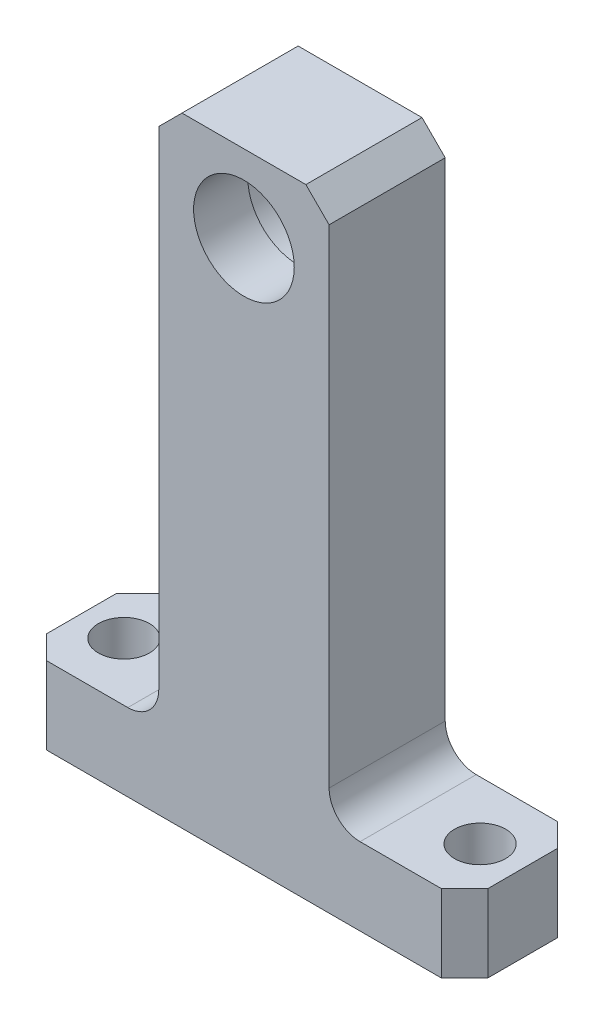
ISO-10303-21;
HEADER;
FILE_DESCRIPTION(('STEP AP214'),'2;1');
FILE_NAME('part.step','',(''),(''),'','','');
FILE_SCHEMA(('AUTOMOTIVE_DESIGN { 1 0 10303 214 1 1 1 1 }'));
ENDSEC;
DATA;
#1=APPLICATION_CONTEXT('core data for automotive mechanical design processes');
#2=APPLICATION_PROTOCOL_DEFINITION('international standard','automotive_design',2000,#1);
#3=PRODUCT_CONTEXT('',#1,'mechanical');
#4=PRODUCT('Part','Part','',(#3));
#5=PRODUCT_RELATED_PRODUCT_CATEGORY('part','',(#4));
#6=PRODUCT_DEFINITION_FORMATION('','',#4);
#7=PRODUCT_DEFINITION_CONTEXT('part definition',#1,'design');
#8=PRODUCT_DEFINITION('design','',#6,#7);
#9=PRODUCT_DEFINITION_SHAPE('','',#8);
#10=(LENGTH_UNIT() NAMED_UNIT(*) SI_UNIT(.MILLI.,.METRE.));
#11=(NAMED_UNIT(*) PLANE_ANGLE_UNIT() SI_UNIT($,.RADIAN.));
#12=(NAMED_UNIT(*) SI_UNIT($,.STERADIAN.) SOLID_ANGLE_UNIT());
#13=UNCERTAINTY_MEASURE_WITH_UNIT(LENGTH_MEASURE(1.E-05),#10,'distance_accuracy_value','');
#14=(GEOMETRIC_REPRESENTATION_CONTEXT(3) GLOBAL_UNCERTAINTY_ASSIGNED_CONTEXT((#13)) GLOBAL_UNIT_ASSIGNED_CONTEXT((#10,
#11,#12)) REPRESENTATION_CONTEXT('',''));
#15=CARTESIAN_POINT('',(0.,0.,0.));
#16=DIRECTION('',(0.,0.,1.));
#17=DIRECTION('',(1.,0.,0.));
#18=AXIS2_PLACEMENT_3D('',#15,#16,#17);
#19=CARTESIAN_POINT('',(0.,0.,-7.5));
#20=DIRECTION('',(0.,0.,-1.));
#21=DIRECTION('',(-1.,0.,0.));
#22=AXIS2_PLACEMENT_3D('',#19,#20,#21);
#23=PLANE('',#22);
#24=DIRECTION('',(0.,-1.,0.));
#25=VECTOR('',#24,1.);
#26=CARTESIAN_POINT('',(-11.,0.,-7.5));
#27=LINE('',#26,#25);
#28=CARTESIAN_POINT('',(-11.,-3.00000000000002,-7.5));
#29=VERTEX_POINT('',#28);
#30=CARTESIAN_POINT('',(-11.,-66.,-7.5));
#31=VERTEX_POINT('',#30);
#32=EDGE_CURVE('E241',#29,#31,#27,.T.);
#33=ORIENTED_EDGE('',*,*,#32,.F.);
#34=DIRECTION('',(-0.707106781186549,-0.707106781186546,0.));
#35=VECTOR('',#34,1.);
#36=CARTESIAN_POINT('',(-3.99999999999997,3.99999999999998,-7.5));
#37=LINE('',#36,#35);
#38=CARTESIAN_POINT('',(-7.99999999999997,0.,-7.5));
#39=VERTEX_POINT('',#38);
#40=EDGE_CURVE('E349',#29,#39,#37,.F.);
#41=ORIENTED_EDGE('',*,*,#40,.T.);
#42=DIRECTION('',(-1.,0.,0.));
#43=VECTOR('',#42,1.);
#44=CARTESIAN_POINT('',(-11.,0.,-7.5));
#45=LINE('',#44,#43);
#46=CARTESIAN_POINT('',(8.,0.,-7.5));
#47=VERTEX_POINT('',#46);
#48=EDGE_CURVE('E245',#47,#39,#45,.T.);
#49=ORIENTED_EDGE('',*,*,#48,.F.);
#50=DIRECTION('',(-0.707106781186546,0.707106781186549,0.));
#51=VECTOR('',#50,1.);
#52=CARTESIAN_POINT('',(4.00000000000002,4.,-7.5));
#53=LINE('',#52,#51);
#54=CARTESIAN_POINT('',(11.,-3.00000000000002,-7.5));
#55=VERTEX_POINT('',#54);
#56=EDGE_CURVE('E347',#47,#55,#53,.F.);
#57=ORIENTED_EDGE('',*,*,#56,.T.);
#58=DIRECTION('',(0.,1.,0.));
#59=VECTOR('',#58,1.);
#60=CARTESIAN_POINT('',(11.,0.,-7.5));
#61=LINE('',#60,#59);
#62=CARTESIAN_POINT('',(11.,-66.,-7.5));
#63=VERTEX_POINT('',#62);
#64=EDGE_CURVE('E267',#63,#55,#61,.T.);
#65=ORIENTED_EDGE('',*,*,#64,.F.);
#66=CARTESIAN_POINT('',(15.,-66.,-7.5));
#67=DIRECTION('',(0.,0.,-1.));
#68=DIRECTION('',(-1.,0.,0.));
#69=AXIS2_PLACEMENT_3D('',#66,#67,#68);
#70=CIRCLE('',#69,4.);
#71=CARTESIAN_POINT('',(15.,-70.,-7.5));
#72=VERTEX_POINT('',#71);
#73=EDGE_CURVE('E293',#63,#72,#70,.F.);
#74=ORIENTED_EDGE('',*,*,#73,.T.);
#75=DIRECTION('',(-1.,0.,0.));
#76=VECTOR('',#75,1.);
#77=CARTESIAN_POINT('',(11.,-70.,-7.5));
#78=LINE('',#77,#76);
#79=CARTESIAN_POINT('',(25.5,-70.,-7.5));
#80=VERTEX_POINT('',#79);
#81=EDGE_CURVE('E265',#80,#72,#78,.T.);
#82=ORIENTED_EDGE('',*,*,#81,.F.);
#83=DIRECTION('',(0.,-1.,0.));
#84=VECTOR('',#83,1.);
#85=CARTESIAN_POINT('',(25.5,-80.,-7.5));
#86=LINE('',#85,#84);
#87=CARTESIAN_POINT('',(25.5,-80.,-7.5));
#88=VERTEX_POINT('',#87);
#89=EDGE_CURVE('E328',#80,#88,#86,.T.);
#90=ORIENTED_EDGE('',*,*,#89,.T.);
#91=DIRECTION('',(1.,0.,0.));
#92=VECTOR('',#91,1.);
#93=CARTESIAN_POINT('',(-28.5,-80.,-7.5));
#94=LINE('',#93,#92);
#95=CARTESIAN_POINT('',(-25.5,-80.,-7.5));
#96=VERTEX_POINT('',#95);
#97=EDGE_CURVE('E262',#96,#88,#94,.T.);
#98=ORIENTED_EDGE('',*,*,#97,.F.);
#99=DIRECTION('',(0.,1.,0.));
#100=VECTOR('',#99,1.);
#101=CARTESIAN_POINT('',(-25.5,-70.,-7.5));
#102=LINE('',#101,#100);
#103=CARTESIAN_POINT('',(-25.5,-70.,-7.5));
#104=VERTEX_POINT('',#103);
#105=EDGE_CURVE('E326',#96,#104,#102,.T.);
#106=ORIENTED_EDGE('',*,*,#105,.T.);
#107=DIRECTION('',(-1.,0.,0.));
#108=VECTOR('',#107,1.);
#109=CARTESIAN_POINT('',(-11.,-70.,-7.5));
#110=LINE('',#109,#108);
#111=CARTESIAN_POINT('',(-15.,-70.,-7.5));
#112=VERTEX_POINT('',#111);
#113=EDGE_CURVE('E259',#112,#104,#110,.T.);
#114=ORIENTED_EDGE('',*,*,#113,.F.);
#115=CARTESIAN_POINT('',(-15.,-66.,-7.5));
#116=DIRECTION('',(0.,0.,-1.));
#117=DIRECTION('',(-1.,0.,0.));
#118=AXIS2_PLACEMENT_3D('',#115,#116,#117);
#119=CIRCLE('',#118,4.);
#120=EDGE_CURVE('E298',#112,#31,#119,.F.);
#121=ORIENTED_EDGE('',*,*,#120,.T.);
#122=EDGE_LOOP('',(#33,#41,#49,#57,#65,#74,#82,#90,#98,#106,#114,#121));
#123=FACE_BOUND('',#122,.T.);
#124=CARTESIAN_POINT('',(0.,-9.99999999999999,-7.5));
#125=DIRECTION('',(0.,0.,1.));
#126=DIRECTION('',(1.,0.,0.));
#127=AXIS2_PLACEMENT_3D('',#124,#125,#126);
#128=CIRCLE('',#127,7.525);
#129=CARTESIAN_POINT('',(7.525,-9.99999999999999,-7.5));
#130=VERTEX_POINT('',#129);
#131=EDGE_CURVE('E343',#130,#130,#128,.T.);
#132=ORIENTED_EDGE('',*,*,#131,.T.);
#133=EDGE_LOOP('',(#132));
#134=FACE_BOUND('',#133,.T.);
#135=ADVANCED_FACE('F36',(#123,#134),#23,.T.);
#136=CARTESIAN_POINT('',(-28.5,-80.,7.5));
#137=DIRECTION('',(0.,1.,0.));
#138=DIRECTION('',(0.,0.,1.));
#139=AXIS2_PLACEMENT_3D('',#136,#137,#138);
#140=PLANE('',#139);
#141=DIRECTION('',(1.,0.,0.));
#142=VECTOR('',#141,1.);
#143=CARTESIAN_POINT('',(10.,-80.,-2.));
#144=LINE('',#143,#142);
#145=CARTESIAN_POINT('',(10.,-80.,-2.));
#146=VERTEX_POINT('',#145);
#147=CARTESIAN_POINT('',(15.,-80.,-2.));
#148=VERTEX_POINT('',#147);
#149=EDGE_CURVE('E214',#146,#148,#144,.T.);
#150=ORIENTED_EDGE('',*,*,#149,.F.);
#151=CARTESIAN_POINT('',(10.,-80.,0.));
#152=DIRECTION('',(0.,-1.,0.));
#153=DIRECTION('',(0.,0.,-1.));
#154=AXIS2_PLACEMENT_3D('',#151,#152,#153);
#155=CIRCLE('',#154,2.);
#156=CARTESIAN_POINT('',(10.,-80.,2.));
#157=VERTEX_POINT('',#156);
#158=EDGE_CURVE('E185',#157,#146,#155,.T.);
#159=ORIENTED_EDGE('',*,*,#158,.F.);
#160=DIRECTION('',(-1.,0.,0.));
#161=VECTOR('',#160,1.);
#162=CARTESIAN_POINT('',(10.,-80.,2.));
#163=LINE('',#162,#161);
#164=CARTESIAN_POINT('',(15.,-80.,2.));
#165=VERTEX_POINT('',#164);
#166=EDGE_CURVE('E202',#165,#157,#163,.T.);
#167=ORIENTED_EDGE('',*,*,#166,.F.);
#168=CARTESIAN_POINT('',(15.,-80.,0.));
#169=DIRECTION('',(0.,-1.,0.));
#170=DIRECTION('',(0.,0.,-1.));
#171=AXIS2_PLACEMENT_3D('',#168,#169,#170);
#172=CIRCLE('',#171,2.);
#173=EDGE_CURVE('E205',#148,#165,#172,.T.);
#174=ORIENTED_EDGE('',*,*,#173,.F.);
#175=EDGE_LOOP('',(#150,#159,#167,#174));
#176=FACE_BOUND('',#175,.T.);
#177=CARTESIAN_POINT('',(-12.5,-80.,0.));
#178=DIRECTION('',(0.,-1.,0.));
#179=DIRECTION('',(0.,0.,-1.));
#180=AXIS2_PLACEMENT_3D('',#177,#178,#179);
#181=CIRCLE('',#180,1.99999999999999);
#182=CARTESIAN_POINT('',(-12.5,-80.,-1.99999999999999));
#183=VERTEX_POINT('',#182);
#184=EDGE_CURVE('E220',#183,#183,#181,.T.);
#185=ORIENTED_EDGE('',*,*,#184,.F.);
#186=EDGE_LOOP('',(#185));
#187=FACE_BOUND('',#186,.T.);
#188=DIRECTION('',(0.,0.,-1.));
#189=VECTOR('',#188,1.);
#190=CARTESIAN_POINT('',(28.5,-80.,7.5));
#191=LINE('',#190,#189);
#192=CARTESIAN_POINT('',(28.5,-80.,4.49999999999997));
#193=VERTEX_POINT('',#192);
#194=CARTESIAN_POINT('',(28.5,-80.,-4.5));
#195=VERTEX_POINT('',#194);
#196=EDGE_CURVE('E272',#193,#195,#191,.T.);
#197=ORIENTED_EDGE('',*,*,#196,.F.);
#198=DIRECTION('',(0.707106781186545,0.,-0.70710678118655));
#199=VECTOR('',#198,1.);
#200=CARTESIAN_POINT('',(25.5,-80.,7.50000000000001));
#201=LINE('',#200,#199);
#202=CARTESIAN_POINT('',(25.5,-80.,7.5));
#203=VERTEX_POINT('',#202);
#204=EDGE_CURVE('E324',#193,#203,#201,.F.);
#205=ORIENTED_EDGE('',*,*,#204,.T.);
#206=DIRECTION('',(1.,0.,0.));
#207=VECTOR('',#206,1.);
#208=CARTESIAN_POINT('',(-28.5,-80.,7.5));
#209=LINE('',#208,#207);
#210=CARTESIAN_POINT('',(-25.5,-80.,7.5));
#211=VERTEX_POINT('',#210);
#212=EDGE_CURVE('E248',#211,#203,#209,.T.);
#213=ORIENTED_EDGE('',*,*,#212,.F.);
#214=DIRECTION('',(0.707106781186546,0.,0.707106781186549));
#215=VECTOR('',#214,1.);
#216=CARTESIAN_POINT('',(-25.5,-80.,7.50000000000001));
#217=LINE('',#216,#215);
#218=CARTESIAN_POINT('',(-28.5,-80.,4.49999999999997));
#219=VERTEX_POINT('',#218);
#220=EDGE_CURVE('E318',#211,#219,#217,.F.);
#221=ORIENTED_EDGE('',*,*,#220,.T.);
#222=DIRECTION('',(0.,0.,-1.));
#223=VECTOR('',#222,1.);
#224=CARTESIAN_POINT('',(-28.5,-80.,7.5));
#225=LINE('',#224,#223);
#226=CARTESIAN_POINT('',(-28.5,-80.,-4.5));
#227=VERTEX_POINT('',#226);
#228=EDGE_CURVE('E275',#219,#227,#225,.T.);
#229=ORIENTED_EDGE('',*,*,#228,.T.);
#230=DIRECTION('',(0.707106781186547,0.,-0.707106781186547));
#231=VECTOR('',#230,1.);
#232=CARTESIAN_POINT('',(-28.5,-80.,-4.5));
#233=LINE('',#232,#231);
#234=EDGE_CURVE('E320',#227,#96,#233,.T.);
#235=ORIENTED_EDGE('',*,*,#234,.T.);
#236=ORIENTED_EDGE('',*,*,#97,.T.);
#237=DIRECTION('',(0.707106781186547,0.,0.707106781186548));
#238=VECTOR('',#237,1.);
#239=CARTESIAN_POINT('',(28.5,-80.,-4.5));
#240=LINE('',#239,#238);
#241=EDGE_CURVE('E322',#88,#195,#240,.T.);
#242=ORIENTED_EDGE('',*,*,#241,.T.);
#243=EDGE_LOOP('',(#197,#205,#213,#221,#229,#235,#236,#242));
#244=FACE_BOUND('',#243,.T.);
#245=CARTESIAN_POINT('',(23.,-80.,0.));
#246=DIRECTION('',(0.,-1.,0.));
#247=DIRECTION('',(0.,0.,-1.));
#248=AXIS2_PLACEMENT_3D('',#245,#246,#247);
#249=CIRCLE('',#248,3.29999999999999);
#250=CARTESIAN_POINT('',(23.,-80.,-3.29999999999999));
#251=VERTEX_POINT('',#250);
#252=EDGE_CURVE('E235',#251,#251,#249,.T.);
#253=ORIENTED_EDGE('',*,*,#252,.F.);
#254=EDGE_LOOP('',(#253));
#255=FACE_BOUND('',#254,.T.);
#256=CARTESIAN_POINT('',(-23.,-80.,0.));
#257=DIRECTION('',(0.,-1.,0.));
#258=DIRECTION('',(0.,0.,-1.));
#259=AXIS2_PLACEMENT_3D('',#256,#257,#258);
#260=CIRCLE('',#259,3.29999999999999);
#261=CARTESIAN_POINT('',(-23.,-80.,-3.29999999999999));
#262=VERTEX_POINT('',#261);
#263=EDGE_CURVE('E229',#262,#262,#260,.T.);
#264=ORIENTED_EDGE('',*,*,#263,.F.);
#265=EDGE_LOOP('',(#264));
#266=FACE_BOUND('',#265,.T.);
#267=ADVANCED_FACE('F392',(#176,#187,#244,#255,#266),#140,.F.);
#268=CARTESIAN_POINT('',(-11.,0.,7.5));
#269=DIRECTION('',(1.,0.,0.));
#270=DIRECTION('',(0.,1.,0.));
#271=AXIS2_PLACEMENT_3D('',#268,#269,#270);
#272=PLANE('',#271);
#273=DIRECTION('',(0.,-1.,0.));
#274=VECTOR('',#273,1.);
#275=CARTESIAN_POINT('',(-11.,0.,7.5));
#276=LINE('',#275,#274);
#277=CARTESIAN_POINT('',(-11.,-3.00000000000002,7.5));
#278=VERTEX_POINT('',#277);
#279=CARTESIAN_POINT('',(-11.,-66.,7.5));
#280=VERTEX_POINT('',#279);
#281=EDGE_CURVE('E242',#278,#280,#276,.T.);
#282=ORIENTED_EDGE('',*,*,#281,.F.);
#283=DIRECTION('',(0.,0.,-1.));
#284=VECTOR('',#283,1.);
#285=CARTESIAN_POINT('',(-11.,-3.00000000000002,7.5));
#286=LINE('',#285,#284);
#287=EDGE_CURVE('E339',#278,#29,#286,.T.);
#288=ORIENTED_EDGE('',*,*,#287,.T.);
#289=ORIENTED_EDGE('',*,*,#32,.T.);
#290=DIRECTION('',(0.,0.,-1.));
#291=VECTOR('',#290,1.);
#292=CARTESIAN_POINT('',(-11.,-66.,7.5));
#293=LINE('',#292,#291);
#294=EDGE_CURVE('E290',#31,#280,#293,.F.);
#295=ORIENTED_EDGE('',*,*,#294,.T.);
#296=EDGE_LOOP('',(#282,#288,#289,#295));
#297=FACE_BOUND('',#296,.T.);
#298=ADVANCED_FACE('F363',(#297),#272,.F.);
#299=CARTESIAN_POINT('',(-11.,-70.,7.5));
#300=DIRECTION('',(0.,-1.,0.));
#301=DIRECTION('',(0.,0.,-1.));
#302=AXIS2_PLACEMENT_3D('',#299,#300,#301);
#303=PLANE('',#302);
#304=CARTESIAN_POINT('',(-23.,-70.,0.));
#305=DIRECTION('',(0.,-1.,0.));
#306=DIRECTION('',(0.,0.,-1.));
#307=AXIS2_PLACEMENT_3D('',#304,#305,#306);
#308=CIRCLE('',#307,3.29999999999999);
#309=CARTESIAN_POINT('',(-23.,-70.,-3.29999999999999));
#310=VERTEX_POINT('',#309);
#311=EDGE_CURVE('E232',#310,#310,#308,.T.);
#312=ORIENTED_EDGE('',*,*,#311,.T.);
#313=EDGE_LOOP('',(#312));
#314=FACE_BOUND('',#313,.T.);
#315=ORIENTED_EDGE('',*,*,#113,.T.);
#316=DIRECTION('',(-0.707106781186548,0.,0.707106781186548));
#317=VECTOR('',#316,1.);
#318=CARTESIAN_POINT('',(-28.5,-70.,-4.5));
#319=LINE('',#318,#317);
#320=CARTESIAN_POINT('',(-28.5,-70.,-4.49999999999999));
#321=VERTEX_POINT('',#320);
#322=EDGE_CURVE('E337',#104,#321,#319,.T.);
#323=ORIENTED_EDGE('',*,*,#322,.T.);
#324=DIRECTION('',(0.,0.,-1.));
#325=VECTOR('',#324,1.);
#326=CARTESIAN_POINT('',(-28.5,-70.,7.5));
#327=LINE('',#326,#325);
#328=CARTESIAN_POINT('',(-28.5,-70.,4.49999999999997));
#329=VERTEX_POINT('',#328);
#330=EDGE_CURVE('E278',#329,#321,#327,.T.);
#331=ORIENTED_EDGE('',*,*,#330,.F.);
#332=DIRECTION('',(-0.707106781186546,0.,-0.707106781186549));
#333=VECTOR('',#332,1.);
#334=CARTESIAN_POINT('',(-25.5,-70.,7.50000000000001));
#335=LINE('',#334,#333);
#336=CARTESIAN_POINT('',(-25.5,-70.,7.5));
#337=VERTEX_POINT('',#336);
#338=EDGE_CURVE('E335',#329,#337,#335,.F.);
#339=ORIENTED_EDGE('',*,*,#338,.T.);
#340=DIRECTION('',(-1.,0.,0.));
#341=VECTOR('',#340,1.);
#342=CARTESIAN_POINT('',(-11.,-70.,7.5));
#343=LINE('',#342,#341);
#344=CARTESIAN_POINT('',(-15.,-70.,7.5));
#345=VERTEX_POINT('',#344);
#346=EDGE_CURVE('E244',#345,#337,#343,.T.);
#347=ORIENTED_EDGE('',*,*,#346,.F.);
#348=DIRECTION('',(0.,0.,-1.));
#349=VECTOR('',#348,1.);
#350=CARTESIAN_POINT('',(-15.,-70.,-7.5));
#351=LINE('',#350,#349);
#352=EDGE_CURVE('E287',#345,#112,#351,.T.);
#353=ORIENTED_EDGE('',*,*,#352,.T.);
#354=EDGE_LOOP('',(#315,#323,#331,#339,#347,#353));
#355=FACE_BOUND('',#354,.T.);
#356=ADVANCED_FACE('F421',(#314,#355),#303,.F.);
#357=CARTESIAN_POINT('',(-28.5,-70.,7.5));
#358=DIRECTION('',(1.,0.,0.));
#359=DIRECTION('',(0.,1.,0.));
#360=AXIS2_PLACEMENT_3D('',#357,#358,#359);
#361=PLANE('',#360);
#362=ORIENTED_EDGE('',*,*,#330,.T.);
#363=DIRECTION('',(0.,-1.,0.));
#364=VECTOR('',#363,1.);
#365=CARTESIAN_POINT('',(-28.5,-80.,-4.5));
#366=LINE('',#365,#364);
#367=EDGE_CURVE('E332',#321,#227,#366,.T.);
#368=ORIENTED_EDGE('',*,*,#367,.T.);
#369=ORIENTED_EDGE('',*,*,#228,.F.);
#370=DIRECTION('',(0.,1.,0.));
#371=VECTOR('',#370,1.);
#372=CARTESIAN_POINT('',(-28.5,-70.,4.49999999999997));
#373=LINE('',#372,#371);
#374=EDGE_CURVE('E330',#219,#329,#373,.T.);
#375=ORIENTED_EDGE('',*,*,#374,.T.);
#376=EDGE_LOOP('',(#362,#368,#369,#375));
#377=FACE_BOUND('',#376,.T.);
#378=ADVANCED_FACE('F412',(#377),#361,.F.);
#379=CARTESIAN_POINT('',(28.5,-80.,7.5));
#380=DIRECTION('',(-1.,0.,0.));
#381=DIRECTION('',(0.,-1.,0.));
#382=AXIS2_PLACEMENT_3D('',#379,#380,#381);
#383=PLANE('',#382);
#384=DIRECTION('',(0.,0.,-1.));
#385=VECTOR('',#384,1.);
#386=CARTESIAN_POINT('',(28.5,-70.,7.5));
#387=LINE('',#386,#385);
#388=CARTESIAN_POINT('',(28.5,-70.,4.49999999999997));
#389=VERTEX_POINT('',#388);
#390=CARTESIAN_POINT('',(28.5,-70.,-4.5));
#391=VERTEX_POINT('',#390);
#392=EDGE_CURVE('E257',#389,#391,#387,.T.);
#393=ORIENTED_EDGE('',*,*,#392,.F.);
#394=DIRECTION('',(0.,-1.,0.));
#395=VECTOR('',#394,1.);
#396=CARTESIAN_POINT('',(28.5,-80.,4.49999999999997));
#397=LINE('',#396,#395);
#398=EDGE_CURVE('E316',#389,#193,#397,.T.);
#399=ORIENTED_EDGE('',*,*,#398,.T.);
#400=ORIENTED_EDGE('',*,*,#196,.T.);
#401=DIRECTION('',(0.,1.,0.));
#402=VECTOR('',#401,1.);
#403=CARTESIAN_POINT('',(28.5,-70.,-4.5));
#404=LINE('',#403,#402);
#405=EDGE_CURVE('E313',#195,#391,#404,.T.);
#406=ORIENTED_EDGE('',*,*,#405,.T.);
#407=EDGE_LOOP('',(#393,#399,#400,#406));
#408=FACE_BOUND('',#407,.T.);
#409=ADVANCED_FACE('F397',(#408),#383,.F.);
#410=CARTESIAN_POINT('',(11.,-70.,7.5));
#411=DIRECTION('',(0.,-1.,0.));
#412=DIRECTION('',(0.,0.,-1.));
#413=AXIS2_PLACEMENT_3D('',#410,#411,#412);
#414=PLANE('',#413);
#415=CARTESIAN_POINT('',(23.,-70.,0.));
#416=DIRECTION('',(0.,-1.,0.));
#417=DIRECTION('',(0.,0.,-1.));
#418=AXIS2_PLACEMENT_3D('',#415,#416,#417);
#419=CIRCLE('',#418,3.29999999999999);
#420=CARTESIAN_POINT('',(23.,-70.,-3.29999999999999));
#421=VERTEX_POINT('',#420);
#422=EDGE_CURVE('E238',#421,#421,#419,.T.);
#423=ORIENTED_EDGE('',*,*,#422,.T.);
#424=EDGE_LOOP('',(#423));
#425=FACE_BOUND('',#424,.T.);
#426=DIRECTION('',(-1.,0.,0.));
#427=VECTOR('',#426,1.);
#428=CARTESIAN_POINT('',(11.,-70.,7.5));
#429=LINE('',#428,#427);
#430=CARTESIAN_POINT('',(25.5,-70.,7.5));
#431=VERTEX_POINT('',#430);
#432=CARTESIAN_POINT('',(15.,-70.,7.5));
#433=VERTEX_POINT('',#432);
#434=EDGE_CURVE('E251',#431,#433,#429,.T.);
#435=ORIENTED_EDGE('',*,*,#434,.F.);
#436=DIRECTION('',(-0.707106781186545,0.,0.70710678118655));
#437=VECTOR('',#436,1.);
#438=CARTESIAN_POINT('',(25.5,-70.,7.50000000000001));
#439=LINE('',#438,#437);
#440=EDGE_CURVE('E311',#431,#389,#439,.F.);
#441=ORIENTED_EDGE('',*,*,#440,.T.);
#442=ORIENTED_EDGE('',*,*,#392,.T.);
#443=DIRECTION('',(-0.707106781186547,0.,-0.707106781186548));
#444=VECTOR('',#443,1.);
#445=CARTESIAN_POINT('',(28.5,-70.,-4.5));
#446=LINE('',#445,#444);
#447=EDGE_CURVE('E309',#391,#80,#446,.T.);
#448=ORIENTED_EDGE('',*,*,#447,.T.);
#449=ORIENTED_EDGE('',*,*,#81,.T.);
#450=DIRECTION('',(0.,0.,-1.));
#451=VECTOR('',#450,1.);
#452=CARTESIAN_POINT('',(15.,-70.,7.5));
#453=LINE('',#452,#451);
#454=EDGE_CURVE('E284',#72,#433,#453,.F.);
#455=ORIENTED_EDGE('',*,*,#454,.T.);
#456=EDGE_LOOP('',(#435,#441,#442,#448,#449,#455));
#457=FACE_BOUND('',#456,.T.);
#458=ADVANCED_FACE('F450',(#425,#457),#414,.F.);
#459=CARTESIAN_POINT('',(11.,0.,7.5));
#460=DIRECTION('',(-1.,0.,0.));
#461=DIRECTION('',(0.,-1.,0.));
#462=AXIS2_PLACEMENT_3D('',#459,#460,#461);
#463=PLANE('',#462);
#464=ORIENTED_EDGE('',*,*,#64,.T.);
#465=DIRECTION('',(0.,0.,1.));
#466=VECTOR('',#465,1.);
#467=CARTESIAN_POINT('',(11.,-3.00000000000002,7.5));
#468=LINE('',#467,#466);
#469=CARTESIAN_POINT('',(11.,-3.00000000000002,7.5));
#470=VERTEX_POINT('',#469);
#471=EDGE_CURVE('E12',#55,#470,#468,.T.);
#472=ORIENTED_EDGE('',*,*,#471,.T.);
#473=DIRECTION('',(0.,1.,0.));
#474=VECTOR('',#473,1.);
#475=CARTESIAN_POINT('',(11.,0.,7.5));
#476=LINE('',#475,#474);
#477=CARTESIAN_POINT('',(11.,-66.,7.5));
#478=VERTEX_POINT('',#477);
#479=EDGE_CURVE('E253',#478,#470,#476,.T.);
#480=ORIENTED_EDGE('',*,*,#479,.F.);
#481=DIRECTION('',(0.,0.,-1.));
#482=VECTOR('',#481,1.);
#483=CARTESIAN_POINT('',(11.,-66.,-7.5));
#484=LINE('',#483,#482);
#485=EDGE_CURVE('E281',#478,#63,#484,.T.);
#486=ORIENTED_EDGE('',*,*,#485,.T.);
#487=EDGE_LOOP('',(#464,#472,#480,#486));
#488=FACE_BOUND('',#487,.T.);
#489=ADVANCED_FACE('F376',(#488),#463,.F.);
#490=CARTESIAN_POINT('',(-11.,0.,7.5));
#491=DIRECTION('',(0.,-1.,0.));
#492=DIRECTION('',(0.,0.,-1.));
#493=AXIS2_PLACEMENT_3D('',#490,#491,#492);
#494=PLANE('',#493);
#495=ORIENTED_EDGE('',*,*,#48,.T.);
#496=DIRECTION('',(0.,0.,1.));
#497=VECTOR('',#496,1.);
#498=CARTESIAN_POINT('',(-7.99999999999997,0.,7.5));
#499=LINE('',#498,#497);
#500=CARTESIAN_POINT('',(-7.99999999999997,0.,7.5));
#501=VERTEX_POINT('',#500);
#502=EDGE_CURVE('E57',#39,#501,#499,.T.);
#503=ORIENTED_EDGE('',*,*,#502,.T.);
#504=DIRECTION('',(-1.,0.,0.));
#505=VECTOR('',#504,1.);
#506=CARTESIAN_POINT('',(-11.,0.,7.5));
#507=LINE('',#506,#505);
#508=CARTESIAN_POINT('',(8.,0.,7.5));
#509=VERTEX_POINT('',#508);
#510=EDGE_CURVE('E255',#509,#501,#507,.T.);
#511=ORIENTED_EDGE('',*,*,#510,.F.);
#512=DIRECTION('',(0.,0.,-1.));
#513=VECTOR('',#512,1.);
#514=CARTESIAN_POINT('',(8.,0.,7.5));
#515=LINE('',#514,#513);
#516=EDGE_CURVE('E351',#509,#47,#515,.T.);
#517=ORIENTED_EDGE('',*,*,#516,.T.);
#518=EDGE_LOOP('',(#495,#503,#511,#517));
#519=FACE_BOUND('',#518,.T.);
#520=ADVANCED_FACE('F371',(#519),#494,.F.);
#521=CARTESIAN_POINT('',(0.,0.,7.5));
#522=DIRECTION('',(0.,0.,-1.));
#523=DIRECTION('',(-1.,0.,0.));
#524=AXIS2_PLACEMENT_3D('',#521,#522,#523);
#525=PLANE('',#524);
#526=CARTESIAN_POINT('',(0.,-9.99999999999999,7.5));
#527=DIRECTION('',(0.,0.,1.));
#528=DIRECTION('',(1.,0.,0.));
#529=AXIS2_PLACEMENT_3D('',#526,#527,#528);
#530=CIRCLE('',#529,6.5);
#531=CARTESIAN_POINT('',(6.5,-9.99999999999999,7.5));
#532=VERTEX_POINT('',#531);
#533=EDGE_CURVE('E344',#532,#532,#530,.T.);
#534=ORIENTED_EDGE('',*,*,#533,.F.);
#535=EDGE_LOOP('',(#534));
#536=FACE_BOUND('',#535,.T.);
#537=ORIENTED_EDGE('',*,*,#510,.T.);
#538=DIRECTION('',(0.707106781186549,0.707106781186546,0.));
#539=VECTOR('',#538,1.);
#540=CARTESIAN_POINT('',(-11.,-3.00000000000002,7.5));
#541=LINE('',#540,#539);
#542=EDGE_CURVE('E44',#501,#278,#541,.F.);
#543=ORIENTED_EDGE('',*,*,#542,.T.);
#544=ORIENTED_EDGE('',*,*,#281,.T.);
#545=CARTESIAN_POINT('',(-15.,-66.,7.5));
#546=DIRECTION('',(0.,0.,-1.));
#547=DIRECTION('',(-1.,0.,0.));
#548=AXIS2_PLACEMENT_3D('',#545,#546,#547);
#549=CIRCLE('',#548,4.);
#550=EDGE_CURVE('E301',#280,#345,#549,.T.);
#551=ORIENTED_EDGE('',*,*,#550,.T.);
#552=ORIENTED_EDGE('',*,*,#346,.T.);
#553=DIRECTION('',(0.,-1.,0.));
#554=VECTOR('',#553,1.);
#555=CARTESIAN_POINT('',(-25.5,0.,7.5));
#556=LINE('',#555,#554);
#557=EDGE_CURVE('E303',#337,#211,#556,.T.);
#558=ORIENTED_EDGE('',*,*,#557,.T.);
#559=ORIENTED_EDGE('',*,*,#212,.T.);
#560=DIRECTION('',(0.,1.,0.));
#561=VECTOR('',#560,1.);
#562=CARTESIAN_POINT('',(25.5,0.,7.5));
#563=LINE('',#562,#561);
#564=EDGE_CURVE('E306',#203,#431,#563,.T.);
#565=ORIENTED_EDGE('',*,*,#564,.T.);
#566=ORIENTED_EDGE('',*,*,#434,.T.);
#567=CARTESIAN_POINT('',(15.,-66.,7.5));
#568=DIRECTION('',(0.,0.,-1.));
#569=DIRECTION('',(-1.,0.,0.));
#570=AXIS2_PLACEMENT_3D('',#567,#568,#569);
#571=CIRCLE('',#570,4.);
#572=EDGE_CURVE('E296',#433,#478,#571,.T.);
#573=ORIENTED_EDGE('',*,*,#572,.T.);
#574=ORIENTED_EDGE('',*,*,#479,.T.);
#575=DIRECTION('',(0.707106781186546,-0.707106781186549,0.));
#576=VECTOR('',#575,1.);
#577=CARTESIAN_POINT('',(8.,0.,7.5));
#578=LINE('',#577,#576);
#579=EDGE_CURVE('E355',#470,#509,#578,.F.);
#580=ORIENTED_EDGE('',*,*,#579,.T.);
#581=EDGE_LOOP('',(#537,#543,#544,#551,#552,#558,#559,#565,#566,#573,#574,#580));
#582=FACE_BOUND('',#581,.T.);
#583=ADVANCED_FACE('F359',(#536,#582),#525,.F.);
#584=CARTESIAN_POINT('',(15.,-66.,7.5));
#585=DIRECTION('',(0.,0.,1.));
#586=DIRECTION('',(1.,0.,0.));
#587=AXIS2_PLACEMENT_3D('',#584,#585,#586);
#588=CYLINDRICAL_SURFACE('',#587,4.);
#589=ORIENTED_EDGE('',*,*,#572,.F.);
#590=ORIENTED_EDGE('',*,*,#454,.F.);
#591=ORIENTED_EDGE('',*,*,#73,.F.);
#592=ORIENTED_EDGE('',*,*,#485,.F.);
#593=EDGE_LOOP('',(#589,#590,#591,#592));
#594=FACE_BOUND('',#593,.T.);
#595=ADVANCED_FACE('F380',(#594),#588,.F.);
#596=CARTESIAN_POINT('',(-15.,-66.,7.5));
#597=DIRECTION('',(0.,0.,1.));
#598=DIRECTION('',(1.,0.,0.));
#599=AXIS2_PLACEMENT_3D('',#596,#597,#598);
#600=CYLINDRICAL_SURFACE('',#599,4.);
#601=ORIENTED_EDGE('',*,*,#550,.F.);
#602=ORIENTED_EDGE('',*,*,#294,.F.);
#603=ORIENTED_EDGE('',*,*,#120,.F.);
#604=ORIENTED_EDGE('',*,*,#352,.F.);
#605=EDGE_LOOP('',(#601,#602,#603,#604));
#606=FACE_BOUND('',#605,.T.);
#607=ADVANCED_FACE('F424',(#606),#600,.F.);
#608=CARTESIAN_POINT('',(23.,-80.,0.));
#609=DIRECTION('',(0.,-1.,0.));
#610=DIRECTION('',(0.,0.,-1.));
#611=AXIS2_PLACEMENT_3D('',#608,#609,#610);
#612=CYLINDRICAL_SURFACE('',#611,3.29999999999999);
#613=ORIENTED_EDGE('',*,*,#422,.F.);
#614=EDGE_LOOP('',(#613));
#615=FACE_BOUND('',#614,.T.);
#616=ORIENTED_EDGE('',*,*,#252,.T.);
#617=EDGE_LOOP('',(#616));
#618=FACE_BOUND('',#617,.T.);
#619=ADVANCED_FACE('F426',(#615,#618),#612,.F.);
#620=CARTESIAN_POINT('',(-23.,-80.,0.));
#621=DIRECTION('',(0.,-1.,0.));
#622=DIRECTION('',(0.,0.,-1.));
#623=AXIS2_PLACEMENT_3D('',#620,#621,#622);
#624=CYLINDRICAL_SURFACE('',#623,3.29999999999999);
#625=ORIENTED_EDGE('',*,*,#311,.F.);
#626=EDGE_LOOP('',(#625));
#627=FACE_BOUND('',#626,.T.);
#628=ORIENTED_EDGE('',*,*,#263,.T.);
#629=EDGE_LOOP('',(#628));
#630=FACE_BOUND('',#629,.T.);
#631=ADVANCED_FACE('F432',(#627,#630),#624,.F.);
#632=CARTESIAN_POINT('',(-12.5,-72.,0.));
#633=DIRECTION('',(0.,-1.,0.));
#634=DIRECTION('',(0.,0.,-1.));
#635=AXIS2_PLACEMENT_3D('',#632,#633,#634);
#636=CONICAL_SURFACE('',#635,1.99999999999999,1.02974425867665);
#637=CARTESIAN_POINT('',(-12.5,-70.7982787619449,0.));
#638=VERTEX_POINT('',#637);
#639=VERTEX_LOOP('',#638);
#640=FACE_BOUND('',#639,.T.);
#641=CARTESIAN_POINT('',(-12.5,-72.,0.));
#642=DIRECTION('',(0.,-1.,0.));
#643=DIRECTION('',(0.,0.,-1.));
#644=AXIS2_PLACEMENT_3D('',#641,#642,#643);
#645=CIRCLE('',#644,1.99999999999999);
#646=CARTESIAN_POINT('',(-12.5,-72.,-1.99999999999999));
#647=VERTEX_POINT('',#646);
#648=EDGE_CURVE('E226',#647,#647,#645,.T.);
#649=ORIENTED_EDGE('',*,*,#648,.T.);
#650=EDGE_LOOP('',(#649));
#651=FACE_BOUND('',#650,.T.);
#652=ADVANCED_FACE('F522',(#640,#651),#636,.F.);
#653=CARTESIAN_POINT('',(-12.5,-80.,0.));
#654=DIRECTION('',(0.,-1.,0.));
#655=DIRECTION('',(0.,0.,-1.));
#656=AXIS2_PLACEMENT_3D('',#653,#654,#655);
#657=CYLINDRICAL_SURFACE('',#656,1.99999999999999);
#658=ORIENTED_EDGE('',*,*,#648,.F.);
#659=EDGE_LOOP('',(#658));
#660=FACE_BOUND('',#659,.T.);
#661=ORIENTED_EDGE('',*,*,#184,.T.);
#662=EDGE_LOOP('',(#661));
#663=FACE_BOUND('',#662,.T.);
#664=ADVANCED_FACE('F532',(#660,#663),#657,.F.);
#665=CARTESIAN_POINT('',(10.,-72.,0.));
#666=DIRECTION('',(0.,-1.,0.));
#667=DIRECTION('',(0.,0.,-1.));
#668=AXIS2_PLACEMENT_3D('',#665,#666,#667);
#669=CYLINDRICAL_SURFACE('',#668,2.);
#670=ORIENTED_EDGE('',*,*,#158,.T.);
#671=DIRECTION('',(0.,-1.,0.));
#672=VECTOR('',#671,1.);
#673=CARTESIAN_POINT('',(10.,-72.,-2.));
#674=LINE('',#673,#672);
#675=CARTESIAN_POINT('',(10.,-72.,-2.));
#676=VERTEX_POINT('',#675);
#677=EDGE_CURVE('E178',#676,#146,#674,.T.);
#678=ORIENTED_EDGE('',*,*,#677,.F.);
#679=CARTESIAN_POINT('',(10.,-72.,0.));
#680=DIRECTION('',(0.,-1.,0.));
#681=DIRECTION('',(0.,0.,-1.));
#682=AXIS2_PLACEMENT_3D('',#679,#680,#681);
#683=CIRCLE('',#682,2.);
#684=CARTESIAN_POINT('',(10.,-72.,2.));
#685=VERTEX_POINT('',#684);
#686=EDGE_CURVE('E182',#685,#676,#683,.T.);
#687=ORIENTED_EDGE('',*,*,#686,.F.);
#688=DIRECTION('',(0.,-1.,0.));
#689=VECTOR('',#688,1.);
#690=CARTESIAN_POINT('',(10.,-72.,2.));
#691=LINE('',#690,#689);
#692=EDGE_CURVE('E218',#685,#157,#691,.T.);
#693=ORIENTED_EDGE('',*,*,#692,.T.);
#694=EDGE_LOOP('',(#670,#678,#687,#693));
#695=FACE_BOUND('',#694,.T.);
#696=ADVANCED_FACE('F180',(#695),#669,.F.);
#697=CARTESIAN_POINT('',(10.,-72.,2.));
#698=DIRECTION('',(0.,0.,1.));
#699=DIRECTION('',(1.,0.,0.));
#700=AXIS2_PLACEMENT_3D('',#697,#698,#699);
#701=PLANE('',#700);
#702=ORIENTED_EDGE('',*,*,#166,.T.);
#703=ORIENTED_EDGE('',*,*,#692,.F.);
#704=DIRECTION('',(-1.,0.,0.));
#705=VECTOR('',#704,1.);
#706=CARTESIAN_POINT('',(10.,-72.,2.));
#707=LINE('',#706,#705);
#708=CARTESIAN_POINT('',(15.,-72.,2.));
#709=VERTEX_POINT('',#708);
#710=EDGE_CURVE('E190',#709,#685,#707,.T.);
#711=ORIENTED_EDGE('',*,*,#710,.F.);
#712=DIRECTION('',(0.,-1.,0.));
#713=VECTOR('',#712,1.);
#714=CARTESIAN_POINT('',(15.,-72.,2.));
#715=LINE('',#714,#713);
#716=EDGE_CURVE('E221',#709,#165,#715,.T.);
#717=ORIENTED_EDGE('',*,*,#716,.T.);
#718=EDGE_LOOP('',(#702,#703,#711,#717));
#719=FACE_BOUND('',#718,.T.);
#720=ADVANCED_FACE('F551',(#719),#701,.F.);
#721=CARTESIAN_POINT('',(15.,-72.,0.));
#722=DIRECTION('',(0.,-1.,0.));
#723=DIRECTION('',(0.,0.,-1.));
#724=AXIS2_PLACEMENT_3D('',#721,#722,#723);
#725=CYLINDRICAL_SURFACE('',#724,2.);
#726=ORIENTED_EDGE('',*,*,#173,.T.);
#727=ORIENTED_EDGE('',*,*,#716,.F.);
#728=CARTESIAN_POINT('',(15.,-72.,0.));
#729=DIRECTION('',(0.,-1.,0.));
#730=DIRECTION('',(0.,0.,-1.));
#731=AXIS2_PLACEMENT_3D('',#728,#729,#730);
#732=CIRCLE('',#731,2.);
#733=CARTESIAN_POINT('',(15.,-72.,-2.));
#734=VERTEX_POINT('',#733);
#735=EDGE_CURVE('E198',#734,#709,#732,.T.);
#736=ORIENTED_EDGE('',*,*,#735,.F.);
#737=DIRECTION('',(0.,-1.,0.));
#738=VECTOR('',#737,1.);
#739=CARTESIAN_POINT('',(15.,-72.,-2.));
#740=LINE('',#739,#738);
#741=EDGE_CURVE('E189',#734,#148,#740,.T.);
#742=ORIENTED_EDGE('',*,*,#741,.T.);
#743=EDGE_LOOP('',(#726,#727,#736,#742));
#744=FACE_BOUND('',#743,.T.);
#745=ADVANCED_FACE('F560',(#744),#725,.F.);
#746=CARTESIAN_POINT('',(10.,-72.,-2.));
#747=DIRECTION('',(0.,0.,-1.));
#748=DIRECTION('',(-1.,0.,0.));
#749=AXIS2_PLACEMENT_3D('',#746,#747,#748);
#750=PLANE('',#749);
#751=ORIENTED_EDGE('',*,*,#149,.T.);
#752=ORIENTED_EDGE('',*,*,#741,.F.);
#753=DIRECTION('',(1.,0.,0.));
#754=VECTOR('',#753,1.);
#755=CARTESIAN_POINT('',(10.,-72.,-2.));
#756=LINE('',#755,#754);
#757=EDGE_CURVE('E193',#676,#734,#756,.T.);
#758=ORIENTED_EDGE('',*,*,#757,.F.);
#759=ORIENTED_EDGE('',*,*,#677,.T.);
#760=EDGE_LOOP('',(#751,#752,#758,#759));
#761=FACE_BOUND('',#760,.T.);
#762=ADVANCED_FACE('F194',(#761),#750,.F.);
#763=CARTESIAN_POINT('',(10.,-72.,0.));
#764=DIRECTION('',(0.,-1.,0.));
#765=DIRECTION('',(0.,0.,-1.));
#766=AXIS2_PLACEMENT_3D('',#763,#764,#765);
#767=PLANE('',#766);
#768=ORIENTED_EDGE('',*,*,#686,.T.);
#769=ORIENTED_EDGE('',*,*,#757,.T.);
#770=ORIENTED_EDGE('',*,*,#735,.T.);
#771=ORIENTED_EDGE('',*,*,#710,.T.);
#772=EDGE_LOOP('',(#768,#769,#770,#771));
#773=FACE_BOUND('',#772,.T.);
#774=ADVANCED_FACE('F200',(#773),#767,.T.);
#775=CARTESIAN_POINT('',(25.5,0.,7.5));
#776=DIRECTION('',(-0.70710678118655,0.,-0.707106781186545));
#777=DIRECTION('',(0.,1.,0.));
#778=AXIS2_PLACEMENT_3D('',#775,#776,#777);
#779=PLANE('',#778);
#780=ORIENTED_EDGE('',*,*,#204,.F.);
#781=ORIENTED_EDGE('',*,*,#398,.F.);
#782=ORIENTED_EDGE('',*,*,#440,.F.);
#783=ORIENTED_EDGE('',*,*,#564,.F.);
#784=EDGE_LOOP('',(#780,#781,#782,#783));
#785=FACE_BOUND('',#784,.T.);
#786=ADVANCED_FACE('F400',(#785),#779,.F.);
#787=CARTESIAN_POINT('',(28.5,-80.,-4.5));
#788=DIRECTION('',(0.707106781186548,0.,-0.707106781186547));
#789=DIRECTION('',(0.,-1.,0.));
#790=AXIS2_PLACEMENT_3D('',#787,#788,#789);
#791=PLANE('',#790);
#792=ORIENTED_EDGE('',*,*,#241,.F.);
#793=ORIENTED_EDGE('',*,*,#89,.F.);
#794=ORIENTED_EDGE('',*,*,#447,.F.);
#795=ORIENTED_EDGE('',*,*,#405,.F.);
#796=EDGE_LOOP('',(#792,#793,#794,#795));
#797=FACE_BOUND('',#796,.T.);
#798=ADVANCED_FACE('F388',(#797),#791,.T.);
#799=CARTESIAN_POINT('',(-28.5,-70.,-4.5));
#800=DIRECTION('',(-0.707106781186547,0.,-0.707106781186547));
#801=DIRECTION('',(0.,1.,0.));
#802=AXIS2_PLACEMENT_3D('',#799,#800,#801);
#803=PLANE('',#802);
#804=ORIENTED_EDGE('',*,*,#322,.F.);
#805=ORIENTED_EDGE('',*,*,#105,.F.);
#806=ORIENTED_EDGE('',*,*,#234,.F.);
#807=ORIENTED_EDGE('',*,*,#367,.F.);
#808=EDGE_LOOP('',(#804,#805,#806,#807));
#809=FACE_BOUND('',#808,.T.);
#810=ADVANCED_FACE('F417',(#809),#803,.T.);
#811=CARTESIAN_POINT('',(-25.5,0.,7.5));
#812=DIRECTION('',(0.707106781186549,0.,-0.707106781186546));
#813=DIRECTION('',(0.,-1.,0.));
#814=AXIS2_PLACEMENT_3D('',#811,#812,#813);
#815=PLANE('',#814);
#816=ORIENTED_EDGE('',*,*,#338,.F.);
#817=ORIENTED_EDGE('',*,*,#374,.F.);
#818=ORIENTED_EDGE('',*,*,#220,.F.);
#819=ORIENTED_EDGE('',*,*,#557,.F.);
#820=EDGE_LOOP('',(#816,#817,#818,#819));
#821=FACE_BOUND('',#820,.T.);
#822=ADVANCED_FACE('F408',(#821),#815,.F.);
#823=CARTESIAN_POINT('',(0.,-9.99999999999999,28.7839141137151));
#824=DIRECTION('',(0.,0.,-1.));
#825=DIRECTION('',(-1.,0.,0.));
#826=AXIS2_PLACEMENT_3D('',#823,#824,#825);
#827=CYLINDRICAL_SURFACE('',#826,7.525);
#828=CARTESIAN_POINT('',(0.,-9.99999999999999,0.5));
#829=DIRECTION('',(0.,0.,-1.));
#830=DIRECTION('',(-1.,0.,0.));
#831=AXIS2_PLACEMENT_3D('',#828,#829,#830);
#832=CIRCLE('',#831,7.525);
#833=CARTESIAN_POINT('',(-7.525,-9.99999999999999,0.5));
#834=VERTEX_POINT('',#833);
#835=EDGE_CURVE('E208',#834,#834,#832,.T.);
#836=ORIENTED_EDGE('',*,*,#835,.F.);
#837=EDGE_LOOP('',(#836));
#838=FACE_BOUND('',#837,.T.);
#839=ORIENTED_EDGE('',*,*,#131,.F.);
#840=EDGE_LOOP('',(#839));
#841=FACE_BOUND('',#840,.T.);
#842=ADVANCED_FACE('F613',(#838,#841),#827,.F.);
#843=CARTESIAN_POINT('',(0.,0.,0.5));
#844=DIRECTION('',(0.,0.,-1.));
#845=DIRECTION('',(-1.,0.,0.));
#846=AXIS2_PLACEMENT_3D('',#843,#844,#845);
#847=PLANE('',#846);
#848=CARTESIAN_POINT('',(0.,-9.99999999999999,0.5));
#849=DIRECTION('',(0.,0.,-1.));
#850=DIRECTION('',(-1.,0.,0.));
#851=AXIS2_PLACEMENT_3D('',#848,#849,#850);
#852=CIRCLE('',#851,6.5);
#853=CARTESIAN_POINT('',(-6.5,-9.99999999999999,0.5));
#854=VERTEX_POINT('',#853);
#855=EDGE_CURVE('E340',#854,#854,#852,.T.);
#856=ORIENTED_EDGE('',*,*,#855,.F.);
#857=EDGE_LOOP('',(#856));
#858=FACE_BOUND('',#857,.T.);
#859=ORIENTED_EDGE('',*,*,#835,.T.);
#860=EDGE_LOOP('',(#859));
#861=FACE_BOUND('',#860,.T.);
#862=ADVANCED_FACE('F620',(#858,#861),#847,.T.);
#863=CARTESIAN_POINT('',(0.,-9.99999999999999,-7.5));
#864=DIRECTION('',(0.,0.,1.));
#865=DIRECTION('',(1.,0.,0.));
#866=AXIS2_PLACEMENT_3D('',#863,#864,#865);
#867=CYLINDRICAL_SURFACE('',#866,6.5);
#868=ORIENTED_EDGE('',*,*,#855,.T.);
#869=EDGE_LOOP('',(#868));
#870=FACE_BOUND('',#869,.T.);
#871=ORIENTED_EDGE('',*,*,#533,.T.);
#872=EDGE_LOOP('',(#871));
#873=FACE_BOUND('',#872,.T.);
#874=ADVANCED_FACE('F628',(#870,#873),#867,.F.);
#875=CARTESIAN_POINT('',(-11.,-3.00000000000002,7.5));
#876=DIRECTION('',(0.707106781186546,-0.707106781186549,0.));
#877=DIRECTION('',(0.,0.,-1.));
#878=AXIS2_PLACEMENT_3D('',#875,#876,#877);
#879=PLANE('',#878);
#880=ORIENTED_EDGE('',*,*,#542,.F.);
#881=ORIENTED_EDGE('',*,*,#502,.F.);
#882=ORIENTED_EDGE('',*,*,#40,.F.);
#883=ORIENTED_EDGE('',*,*,#287,.F.);
#884=EDGE_LOOP('',(#880,#881,#882,#883));
#885=FACE_BOUND('',#884,.T.);
#886=ADVANCED_FACE('F367',(#885),#879,.F.);
#887=CARTESIAN_POINT('',(8.,0.,7.5));
#888=DIRECTION('',(-0.707106781186549,-0.707106781186546,0.));
#889=DIRECTION('',(0.,0.,-1.));
#890=AXIS2_PLACEMENT_3D('',#887,#888,#889);
#891=PLANE('',#890);
#892=ORIENTED_EDGE('',*,*,#579,.F.);
#893=ORIENTED_EDGE('',*,*,#471,.F.);
#894=ORIENTED_EDGE('',*,*,#56,.F.);
#895=ORIENTED_EDGE('',*,*,#516,.F.);
#896=EDGE_LOOP('',(#892,#893,#894,#895));
#897=FACE_BOUND('',#896,.T.);
#898=ADVANCED_FACE('F38',(#897),#891,.F.);
#899=CLOSED_SHELL('',(#135,#267,#298,#356,#378,#409,#458,#489,#520,#583,#595,#607,#619,#631,
#652,#664,#696,#720,#745,#762,#774,#786,#798,#810,#822,#842,#862,#874,#886,#898));
#900=MANIFOLD_SOLID_BREP('B2',#899);
#901=ADVANCED_BREP_SHAPE_REPRESENTATION('',(#18,#900),#14);
#902=SHAPE_DEFINITION_REPRESENTATION(#9,#901);
ENDSEC;
END-ISO-10303-21;
